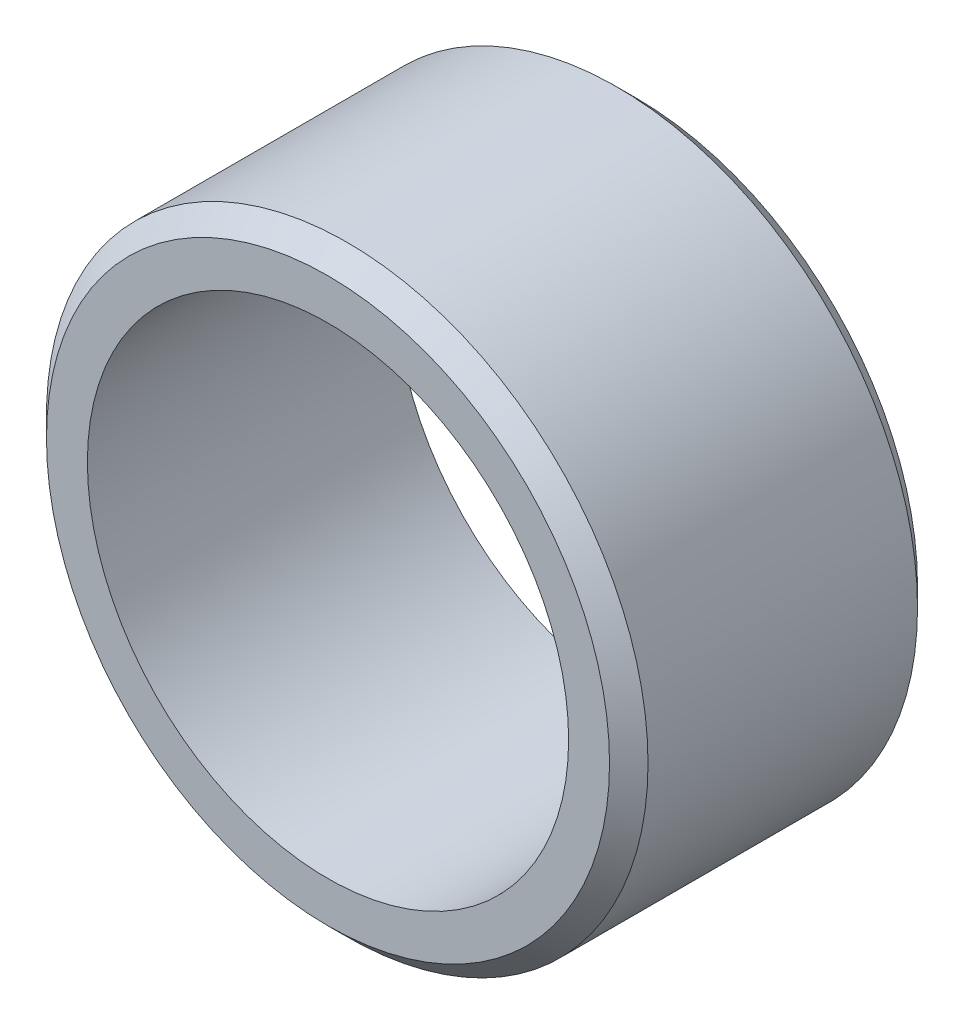
ISO-10303-21;
HEADER;
FILE_DESCRIPTION(('STEP AP214'),'2;1');
FILE_NAME('part.step','',(''),(''),'','','');
FILE_SCHEMA(('AUTOMOTIVE_DESIGN { 1 0 10303 214 1 1 1 1 }'));
ENDSEC;
DATA;
#1=APPLICATION_CONTEXT('core data for automotive mechanical design processes');
#2=APPLICATION_PROTOCOL_DEFINITION('international standard','automotive_design',2000,#1);
#3=PRODUCT_CONTEXT('',#1,'mechanical');
#4=PRODUCT('Part','Part','',(#3));
#5=PRODUCT_RELATED_PRODUCT_CATEGORY('part','',(#4));
#6=PRODUCT_DEFINITION_FORMATION('','',#4);
#7=PRODUCT_DEFINITION_CONTEXT('part definition',#1,'design');
#8=PRODUCT_DEFINITION('design','',#6,#7);
#9=PRODUCT_DEFINITION_SHAPE('','',#8);
#10=(LENGTH_UNIT() NAMED_UNIT(*) SI_UNIT(.MILLI.,.METRE.));
#11=(NAMED_UNIT(*) PLANE_ANGLE_UNIT() SI_UNIT($,.RADIAN.));
#12=(NAMED_UNIT(*) SI_UNIT($,.STERADIAN.) SOLID_ANGLE_UNIT());
#13=UNCERTAINTY_MEASURE_WITH_UNIT(LENGTH_MEASURE(1.E-05),#10,'distance_accuracy_value','');
#14=(GEOMETRIC_REPRESENTATION_CONTEXT(3) GLOBAL_UNCERTAINTY_ASSIGNED_CONTEXT((#13)) GLOBAL_UNIT_ASSIGNED_CONTEXT((#10,
#11,#12)) REPRESENTATION_CONTEXT('',''));
#15=CARTESIAN_POINT('',(0.,0.,0.));
#16=DIRECTION('',(0.,0.,1.));
#17=DIRECTION('',(1.,0.,0.));
#18=AXIS2_PLACEMENT_3D('',#15,#16,#17);
#19=CARTESIAN_POINT('',(0.,0.,8.128));
#20=DIRECTION('',(0.,0.,1.));
#21=DIRECTION('',(1.,0.,0.));
#22=AXIS2_PLACEMENT_3D('',#19,#20,#21);
#23=PLANE('',#22);
#24=CARTESIAN_POINT('',(0.,0.,8.128));
#25=DIRECTION('',(0.,0.,1.));
#26=DIRECTION('',(1.,0.,0.));
#27=AXIS2_PLACEMENT_3D('',#24,#25,#26);
#28=CIRCLE('',#27,7.4295);
#29=CARTESIAN_POINT('',(7.4295,0.,8.128));
#30=VERTEX_POINT('',#29);
#31=EDGE_CURVE('E10',#30,#30,#28,.T.);
#32=ORIENTED_EDGE('',*,*,#31,.T.);
#33=EDGE_LOOP('',(#32));
#34=FACE_BOUND('',#33,.T.);
#35=CARTESIAN_POINT('',(0.,0.,8.128));
#36=DIRECTION('',(0.,0.,1.));
#37=DIRECTION('',(1.,0.,0.));
#38=AXIS2_PLACEMENT_3D('',#35,#36,#37);
#39=CIRCLE('',#38,6.35);
#40=CARTESIAN_POINT('',(6.35,0.,8.128));
#41=VERTEX_POINT('',#40);
#42=EDGE_CURVE('E50',#41,#41,#39,.T.);
#43=ORIENTED_EDGE('',*,*,#42,.F.);
#44=EDGE_LOOP('',(#43));
#45=FACE_BOUND('',#44,.T.);
#46=ADVANCED_FACE('F30',(#34,#45),#23,.T.);
#47=CARTESIAN_POINT('',(0.,0.,0.));
#48=DIRECTION('',(0.,0.,1.));
#49=DIRECTION('',(1.,0.,0.));
#50=AXIS2_PLACEMENT_3D('',#47,#48,#49);
#51=PLANE('',#50);
#52=CARTESIAN_POINT('',(0.,0.,0.));
#53=DIRECTION('',(0.,0.,1.));
#54=DIRECTION('',(1.,0.,0.));
#55=AXIS2_PLACEMENT_3D('',#52,#53,#54);
#56=CIRCLE('',#55,7.4295);
#57=CARTESIAN_POINT('',(7.4295,0.,0.));
#58=VERTEX_POINT('',#57);
#59=EDGE_CURVE('E37',#58,#58,#56,.F.);
#60=ORIENTED_EDGE('',*,*,#59,.T.);
#61=EDGE_LOOP('',(#60));
#62=FACE_BOUND('',#61,.T.);
#63=CARTESIAN_POINT('',(0.,0.,0.));
#64=DIRECTION('',(0.,0.,1.));
#65=DIRECTION('',(1.,0.,0.));
#66=AXIS2_PLACEMENT_3D('',#63,#64,#65);
#67=CIRCLE('',#66,6.35);
#68=CARTESIAN_POINT('',(6.35,0.,0.));
#69=VERTEX_POINT('',#68);
#70=EDGE_CURVE('E51',#69,#69,#67,.T.);
#71=ORIENTED_EDGE('',*,*,#70,.T.);
#72=EDGE_LOOP('',(#71));
#73=FACE_BOUND('',#72,.T.);
#74=ADVANCED_FACE('F61',(#62,#73),#51,.F.);
#75=CARTESIAN_POINT('',(0.,0.,8.128));
#76=DIRECTION('',(0.,0.,-1.));
#77=DIRECTION('',(-1.,0.,0.));
#78=AXIS2_PLACEMENT_3D('',#75,#76,#77);
#79=CYLINDRICAL_SURFACE('',#78,7.9375);
#80=CARTESIAN_POINT('',(0.,0.,0.508000000000002));
#81=DIRECTION('',(0.,0.,1.));
#82=DIRECTION('',(1.,0.,0.));
#83=AXIS2_PLACEMENT_3D('',#80,#81,#82);
#84=CIRCLE('',#83,7.9375);
#85=CARTESIAN_POINT('',(7.9375,0.,0.508000000000002));
#86=VERTEX_POINT('',#85);
#87=EDGE_CURVE('E41',#86,#86,#84,.T.);
#88=ORIENTED_EDGE('',*,*,#87,.T.);
#89=EDGE_LOOP('',(#88));
#90=FACE_BOUND('',#89,.T.);
#91=CARTESIAN_POINT('',(0.,0.,7.62));
#92=DIRECTION('',(0.,0.,1.));
#93=DIRECTION('',(1.,0.,0.));
#94=AXIS2_PLACEMENT_3D('',#91,#92,#93);
#95=CIRCLE('',#94,7.9375);
#96=CARTESIAN_POINT('',(7.9375,0.,7.62));
#97=VERTEX_POINT('',#96);
#98=EDGE_CURVE('E45',#97,#97,#95,.F.);
#99=ORIENTED_EDGE('',*,*,#98,.T.);
#100=EDGE_LOOP('',(#99));
#101=FACE_BOUND('',#100,.T.);
#102=ADVANCED_FACE('F66',(#90,#101),#79,.T.);
#103=CARTESIAN_POINT('',(0.,0.,8.128));
#104=DIRECTION('',(0.,0.,-1.));
#105=DIRECTION('',(-1.,0.,0.));
#106=AXIS2_PLACEMENT_3D('',#103,#104,#105);
#107=CYLINDRICAL_SURFACE('',#106,6.35);
#108=ORIENTED_EDGE('',*,*,#42,.T.);
#109=EDGE_LOOP('',(#108));
#110=FACE_BOUND('',#109,.T.);
#111=ORIENTED_EDGE('',*,*,#70,.F.);
#112=EDGE_LOOP('',(#111));
#113=FACE_BOUND('',#112,.T.);
#114=ADVANCED_FACE('F57',(#110,#113),#107,.F.);
#115=CARTESIAN_POINT('',(0.,0.,0.508000000000002));
#116=DIRECTION('',(0.,0.,1.));
#117=DIRECTION('',(1.,0.,0.));
#118=AXIS2_PLACEMENT_3D('',#115,#116,#117);
#119=CONICAL_SURFACE('',#118,7.9375,0.785398163397452);
#120=ORIENTED_EDGE('',*,*,#59,.F.);
#121=EDGE_LOOP('',(#120));
#122=FACE_BOUND('',#121,.T.);
#123=ORIENTED_EDGE('',*,*,#87,.F.);
#124=EDGE_LOOP('',(#123));
#125=FACE_BOUND('',#124,.T.);
#126=ADVANCED_FACE('F72',(#122,#125),#119,.T.);
#127=CARTESIAN_POINT('',(0.,0.,8.128));
#128=DIRECTION('',(0.,0.,-1.));
#129=DIRECTION('',(-1.,0.,0.));
#130=AXIS2_PLACEMENT_3D('',#127,#128,#129);
#131=CONICAL_SURFACE('',#130,7.4295,0.785398163397448);
#132=ORIENTED_EDGE('',*,*,#98,.F.);
#133=EDGE_LOOP('',(#132));
#134=FACE_BOUND('',#133,.T.);
#135=ORIENTED_EDGE('',*,*,#31,.F.);
#136=EDGE_LOOP('',(#135));
#137=FACE_BOUND('',#136,.T.);
#138=ADVANCED_FACE('F32',(#134,#137),#131,.T.);
#139=CLOSED_SHELL('',(#46,#74,#102,#114,#126,#138));
#140=MANIFOLD_SOLID_BREP('B2',#139);
#141=ADVANCED_BREP_SHAPE_REPRESENTATION('',(#18,#140),#14);
#142=SHAPE_DEFINITION_REPRESENTATION(#9,#141);
ENDSEC;
END-ISO-10303-21;
